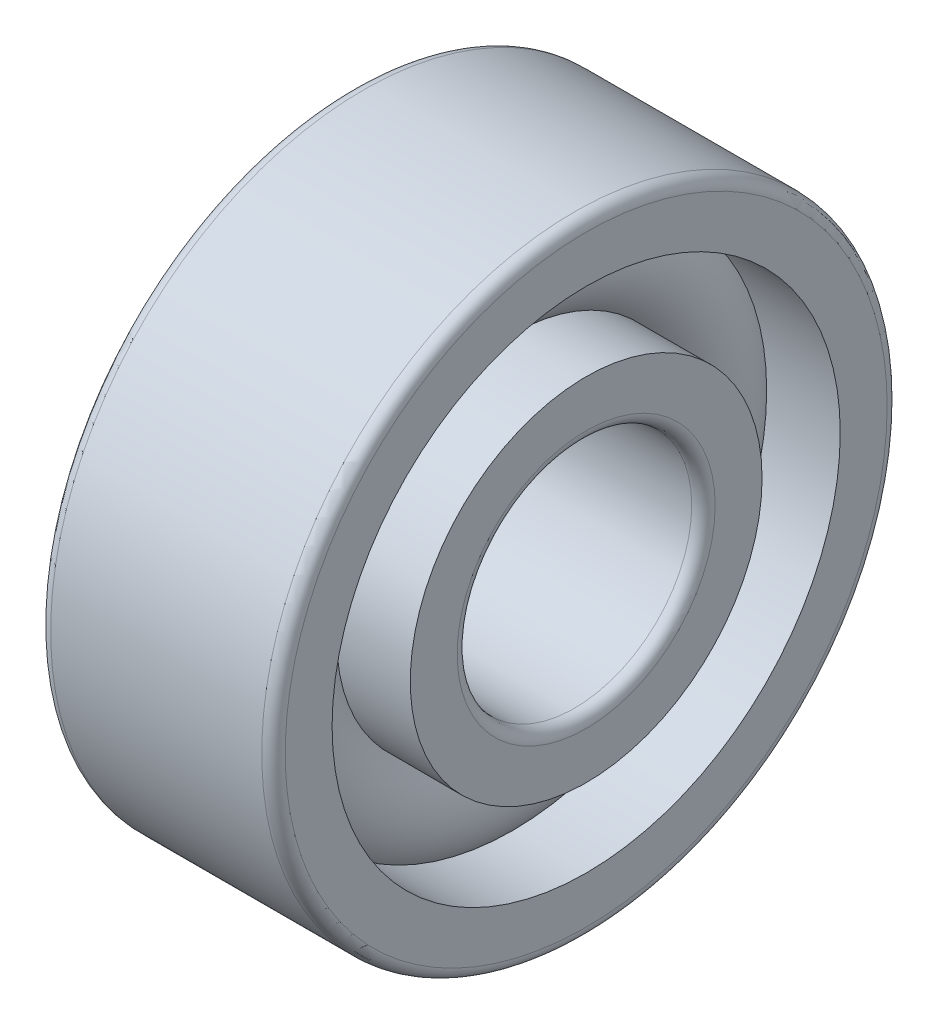
ISO-10303-21;
HEADER;
FILE_DESCRIPTION(('STEP AP214'),'2;1');
FILE_NAME('part.step','',(''),(''),'','','');
FILE_SCHEMA(('AUTOMOTIVE_DESIGN { 1 0 10303 214 1 1 1 1 }'));
ENDSEC;
DATA;
#1=APPLICATION_CONTEXT('core data for automotive mechanical design processes');
#2=APPLICATION_PROTOCOL_DEFINITION('international standard','automotive_design',2000,#1);
#3=PRODUCT_CONTEXT('',#1,'mechanical');
#4=PRODUCT('Part','Part','',(#3));
#5=PRODUCT_RELATED_PRODUCT_CATEGORY('part','',(#4));
#6=PRODUCT_DEFINITION_FORMATION('','',#4);
#7=PRODUCT_DEFINITION_CONTEXT('part definition',#1,'design');
#8=PRODUCT_DEFINITION('design','',#6,#7);
#9=PRODUCT_DEFINITION_SHAPE('','',#8);
#10=(LENGTH_UNIT() NAMED_UNIT(*) SI_UNIT(.MILLI.,.METRE.));
#11=(NAMED_UNIT(*) PLANE_ANGLE_UNIT() SI_UNIT($,.RADIAN.));
#12=(NAMED_UNIT(*) SI_UNIT($,.STERADIAN.) SOLID_ANGLE_UNIT());
#13=UNCERTAINTY_MEASURE_WITH_UNIT(LENGTH_MEASURE(1.E-05),#10,'distance_accuracy_value','');
#14=(GEOMETRIC_REPRESENTATION_CONTEXT(3) GLOBAL_UNCERTAINTY_ASSIGNED_CONTEXT((#13)) GLOBAL_UNIT_ASSIGNED_CONTEXT((#10,
#11,#12)) REPRESENTATION_CONTEXT('',''));
#15=CARTESIAN_POINT('',(0.,0.,0.));
#16=DIRECTION('',(0.,0.,1.));
#17=DIRECTION('',(1.,0.,0.));
#18=AXIS2_PLACEMENT_3D('',#15,#16,#17);
#19=CARTESIAN_POINT('',(0.,0.,0.));
#20=DIRECTION('',(-1.,0.,0.));
#21=DIRECTION('',(0.,0.,1.));
#22=AXIS2_PLACEMENT_3D('',#19,#20,#21);
#23=TOROIDAL_SURFACE('',#22,2.75,0.75);
#24=CARTESIAN_POINT('',(0.559016994374943,0.,0.));
#25=DIRECTION('',(-1.,0.,0.));
#26=DIRECTION('',(0.,0.,1.));
#27=AXIS2_PLACEMENT_3D('',#24,#25,#26);
#28=CIRCLE('',#27,3.25);
#29=CARTESIAN_POINT('',(0.559016994374943,0.,3.25));
#30=VERTEX_POINT('',#29);
#31=EDGE_CURVE('E36',#30,#30,#28,.F.);
#32=ORIENTED_EDGE('',*,*,#31,.T.);
#33=EDGE_LOOP('',(#32));
#34=FACE_BOUND('',#33,.T.);
#35=CARTESIAN_POINT('',(0.559016994374947,0.,0.));
#36=DIRECTION('',(-1.,0.,0.));
#37=DIRECTION('',(0.,0.,1.));
#38=AXIS2_PLACEMENT_3D('',#35,#36,#37);
#39=CIRCLE('',#38,2.25);
#40=CARTESIAN_POINT('',(0.559016994374947,0.,2.25));
#41=VERTEX_POINT('',#40);
#42=EDGE_CURVE('E10',#41,#41,#39,.T.);
#43=ORIENTED_EDGE('',*,*,#42,.T.);
#44=EDGE_LOOP('',(#43));
#45=FACE_BOUND('',#44,.T.);
#46=ADVANCED_FACE('F32',(#34,#45),#23,.T.);
#47=CARTESIAN_POINT('',(-20.6375,0.,0.));
#48=DIRECTION('',(1.,0.,0.));
#49=DIRECTION('',(0.,0.,-1.));
#50=AXIS2_PLACEMENT_3D('',#47,#48,#49);
#51=CYLINDRICAL_SURFACE('',#50,2.25);
#52=CARTESIAN_POINT('',(1.5,0.,0.));
#53=DIRECTION('',(1.,0.,0.));
#54=DIRECTION('',(0.,0.,-1.));
#55=AXIS2_PLACEMENT_3D('',#52,#53,#54);
#56=CIRCLE('',#55,2.25);
#57=CARTESIAN_POINT('',(1.5,0.,-2.25));
#58=VERTEX_POINT('',#57);
#59=EDGE_CURVE('E45',#58,#58,#56,.T.);
#60=ORIENTED_EDGE('',*,*,#59,.F.);
#61=EDGE_LOOP('',(#60));
#62=FACE_BOUND('',#61,.T.);
#63=ORIENTED_EDGE('',*,*,#42,.F.);
#64=EDGE_LOOP('',(#63));
#65=FACE_BOUND('',#64,.T.);
#66=ADVANCED_FACE('F84',(#62,#65),#51,.T.);
#67=CARTESIAN_POINT('',(-20.6375,0.,0.));
#68=DIRECTION('',(1.,0.,0.));
#69=DIRECTION('',(0.,0.,-1.));
#70=AXIS2_PLACEMENT_3D('',#67,#68,#69);
#71=CYLINDRICAL_SURFACE('',#70,2.25);
#72=CARTESIAN_POINT('',(-1.5,0.,0.));
#73=DIRECTION('',(1.,0.,0.));
#74=DIRECTION('',(0.,0.,-1.));
#75=AXIS2_PLACEMENT_3D('',#72,#73,#74);
#76=CIRCLE('',#75,2.25);
#77=CARTESIAN_POINT('',(-1.5,0.,-2.25));
#78=VERTEX_POINT('',#77);
#79=EDGE_CURVE('E54',#78,#78,#76,.T.);
#80=ORIENTED_EDGE('',*,*,#79,.T.);
#81=EDGE_LOOP('',(#80));
#82=FACE_BOUND('',#81,.T.);
#83=CARTESIAN_POINT('',(-0.559016994374947,0.,0.));
#84=DIRECTION('',(1.,0.,0.));
#85=DIRECTION('',(0.,0.,-1.));
#86=AXIS2_PLACEMENT_3D('',#83,#84,#85);
#87=CIRCLE('',#86,2.25);
#88=CARTESIAN_POINT('',(-0.559016994374947,0.,-2.25));
#89=VERTEX_POINT('',#88);
#90=EDGE_CURVE('E40',#89,#89,#87,.T.);
#91=ORIENTED_EDGE('',*,*,#90,.F.);
#92=EDGE_LOOP('',(#91));
#93=FACE_BOUND('',#92,.T.);
#94=ADVANCED_FACE('F87',(#82,#93),#71,.T.);
#95=CARTESIAN_POINT('',(1.5,1.65,0.));
#96=DIRECTION('',(1.,0.,0.));
#97=DIRECTION('',(0.,0.,-1.));
#98=AXIS2_PLACEMENT_3D('',#95,#96,#97);
#99=PLANE('',#98);
#100=ORIENTED_EDGE('',*,*,#59,.T.);
#101=EDGE_LOOP('',(#100));
#102=FACE_BOUND('',#101,.T.);
#103=CARTESIAN_POINT('',(1.5,0.,0.));
#104=DIRECTION('',(1.,0.,0.));
#105=DIRECTION('',(0.,0.,-1.));
#106=AXIS2_PLACEMENT_3D('',#103,#104,#105);
#107=CIRCLE('',#106,1.65);
#108=CARTESIAN_POINT('',(1.5,0.,-1.65));
#109=VERTEX_POINT('',#108);
#110=EDGE_CURVE('E76',#109,#109,#107,.T.);
#111=ORIENTED_EDGE('',*,*,#110,.F.);
#112=EDGE_LOOP('',(#111));
#113=FACE_BOUND('',#112,.T.);
#114=ADVANCED_FACE('F81',(#102,#113),#99,.T.);
#115=CARTESIAN_POINT('',(1.35,0.,0.));
#116=DIRECTION('',(1.,0.,0.));
#117=DIRECTION('',(0.,0.,-1.));
#118=AXIS2_PLACEMENT_3D('',#115,#116,#117);
#119=TOROIDAL_SURFACE('',#118,1.65,0.15);
#120=ORIENTED_EDGE('',*,*,#110,.T.);
#121=EDGE_LOOP('',(#120));
#122=FACE_BOUND('',#121,.T.);
#123=CARTESIAN_POINT('',(1.35,0.,0.));
#124=DIRECTION('',(1.,0.,0.));
#125=DIRECTION('',(0.,0.,-1.));
#126=AXIS2_PLACEMENT_3D('',#123,#124,#125);
#127=CIRCLE('',#126,1.5);
#128=CARTESIAN_POINT('',(1.35,0.,-1.5));
#129=VERTEX_POINT('',#128);
#130=EDGE_CURVE('E73',#129,#129,#127,.T.);
#131=ORIENTED_EDGE('',*,*,#130,.F.);
#132=EDGE_LOOP('',(#131));
#133=FACE_BOUND('',#132,.T.);
#134=ADVANCED_FACE('F98',(#122,#133),#119,.T.);
#135=CARTESIAN_POINT('',(-20.6375,0.,0.));
#136=DIRECTION('',(1.,0.,0.));
#137=DIRECTION('',(0.,0.,-1.));
#138=AXIS2_PLACEMENT_3D('',#135,#136,#137);
#139=CYLINDRICAL_SURFACE('',#138,1.5);
#140=ORIENTED_EDGE('',*,*,#130,.T.);
#141=EDGE_LOOP('',(#140));
#142=FACE_BOUND('',#141,.T.);
#143=CARTESIAN_POINT('',(-1.35,0.,0.));
#144=DIRECTION('',(1.,0.,0.));
#145=DIRECTION('',(0.,0.,-1.));
#146=AXIS2_PLACEMENT_3D('',#143,#144,#145);
#147=CIRCLE('',#146,1.5);
#148=CARTESIAN_POINT('',(-1.35,0.,-1.5));
#149=VERTEX_POINT('',#148);
#150=EDGE_CURVE('E70',#149,#149,#147,.T.);
#151=ORIENTED_EDGE('',*,*,#150,.F.);
#152=EDGE_LOOP('',(#151));
#153=FACE_BOUND('',#152,.T.);
#154=ADVANCED_FACE('F101',(#142,#153),#139,.F.);
#155=CARTESIAN_POINT('',(-1.35,0.,0.));
#156=DIRECTION('',(1.,0.,0.));
#157=DIRECTION('',(0.,0.,-1.));
#158=AXIS2_PLACEMENT_3D('',#155,#156,#157);
#159=TOROIDAL_SURFACE('',#158,1.65,0.15);
#160=ORIENTED_EDGE('',*,*,#150,.T.);
#161=EDGE_LOOP('',(#160));
#162=FACE_BOUND('',#161,.T.);
#163=CARTESIAN_POINT('',(-1.5,0.,0.));
#164=DIRECTION('',(1.,0.,0.));
#165=DIRECTION('',(0.,0.,-1.));
#166=AXIS2_PLACEMENT_3D('',#163,#164,#165);
#167=CIRCLE('',#166,1.65);
#168=CARTESIAN_POINT('',(-1.5,0.,-1.65));
#169=VERTEX_POINT('',#168);
#170=EDGE_CURVE('E67',#169,#169,#167,.T.);
#171=ORIENTED_EDGE('',*,*,#170,.F.);
#172=EDGE_LOOP('',(#171));
#173=FACE_BOUND('',#172,.T.);
#174=ADVANCED_FACE('F105',(#162,#173),#159,.T.);
#175=CARTESIAN_POINT('',(-1.5,2.25,0.));
#176=DIRECTION('',(-1.,0.,0.));
#177=DIRECTION('',(0.,0.,1.));
#178=AXIS2_PLACEMENT_3D('',#175,#176,#177);
#179=PLANE('',#178);
#180=ORIENTED_EDGE('',*,*,#170,.T.);
#181=EDGE_LOOP('',(#180));
#182=FACE_BOUND('',#181,.T.);
#183=ORIENTED_EDGE('',*,*,#79,.F.);
#184=EDGE_LOOP('',(#183));
#185=FACE_BOUND('',#184,.T.);
#186=ADVANCED_FACE('F109',(#182,#185),#179,.T.);
#187=CARTESIAN_POINT('',(-0.559016994374943,0.,0.));
#188=DIRECTION('',(1.,0.,0.));
#189=DIRECTION('',(0.,0.,-1.));
#190=AXIS2_PLACEMENT_3D('',#187,#188,#189);
#191=CIRCLE('',#190,3.25);
#192=CARTESIAN_POINT('',(-0.559016994374943,0.,-3.25));
#193=VERTEX_POINT('',#192);
#194=EDGE_CURVE('E48',#193,#193,#191,.F.);
#195=ORIENTED_EDGE('',*,*,#194,.T.);
#196=EDGE_LOOP('',(#195));
#197=FACE_BOUND('',#196,.T.);
#198=ORIENTED_EDGE('',*,*,#90,.T.);
#199=EDGE_LOOP('',(#198));
#200=FACE_BOUND('',#199,.T.);
#201=ADVANCED_FACE('F34',(#197,#200),#23,.T.);
#202=CARTESIAN_POINT('',(-20.6375,0.,0.));
#203=DIRECTION('',(1.,0.,0.));
#204=DIRECTION('',(0.,0.,-1.));
#205=AXIS2_PLACEMENT_3D('',#202,#203,#204);
#206=CYLINDRICAL_SURFACE('',#205,3.25);
#207=CARTESIAN_POINT('',(1.5,0.,0.));
#208=DIRECTION('',(1.,0.,0.));
#209=DIRECTION('',(0.,0.,-1.));
#210=AXIS2_PLACEMENT_3D('',#207,#208,#209);
#211=CIRCLE('',#210,3.25);
#212=CARTESIAN_POINT('',(1.5,0.,-3.25));
#213=VERTEX_POINT('',#212);
#214=EDGE_CURVE('E50',#213,#213,#211,.T.);
#215=ORIENTED_EDGE('',*,*,#214,.T.);
#216=EDGE_LOOP('',(#215));
#217=FACE_BOUND('',#216,.T.);
#218=ORIENTED_EDGE('',*,*,#31,.F.);
#219=EDGE_LOOP('',(#218));
#220=FACE_BOUND('',#219,.T.);
#221=ADVANCED_FACE('F114',(#217,#220),#206,.F.);
#222=CARTESIAN_POINT('',(-20.6375,0.,0.));
#223=DIRECTION('',(1.,0.,0.));
#224=DIRECTION('',(0.,0.,-1.));
#225=AXIS2_PLACEMENT_3D('',#222,#223,#224);
#226=CYLINDRICAL_SURFACE('',#225,3.25);
#227=CARTESIAN_POINT('',(-1.5,0.,0.));
#228=DIRECTION('',(1.,0.,0.));
#229=DIRECTION('',(0.,0.,-1.));
#230=AXIS2_PLACEMENT_3D('',#227,#228,#229);
#231=CIRCLE('',#230,3.25);
#232=CARTESIAN_POINT('',(-1.5,0.,-3.25));
#233=VERTEX_POINT('',#232);
#234=EDGE_CURVE('E145',#233,#233,#231,.T.);
#235=ORIENTED_EDGE('',*,*,#234,.F.);
#236=EDGE_LOOP('',(#235));
#237=FACE_BOUND('',#236,.T.);
#238=ORIENTED_EDGE('',*,*,#194,.F.);
#239=EDGE_LOOP('',(#238));
#240=FACE_BOUND('',#239,.T.);
#241=ADVANCED_FACE('F117',(#237,#240),#226,.F.);
#242=CARTESIAN_POINT('',(1.5,3.85000000000001,0.));
#243=DIRECTION('',(1.,0.,0.));
#244=DIRECTION('',(0.,0.,-1.));
#245=AXIS2_PLACEMENT_3D('',#242,#243,#244);
#246=PLANE('',#245);
#247=CARTESIAN_POINT('',(1.5,0.,0.));
#248=DIRECTION('',(1.,0.,0.));
#249=DIRECTION('',(0.,0.,-1.));
#250=AXIS2_PLACEMENT_3D('',#247,#248,#249);
#251=CIRCLE('',#250,3.85000000000001);
#252=CARTESIAN_POINT('',(1.5,0.,-3.85000000000001));
#253=VERTEX_POINT('',#252);
#254=EDGE_CURVE('E56',#253,#253,#251,.T.);
#255=ORIENTED_EDGE('',*,*,#254,.T.);
#256=EDGE_LOOP('',(#255));
#257=FACE_BOUND('',#256,.T.);
#258=ORIENTED_EDGE('',*,*,#214,.F.);
#259=EDGE_LOOP('',(#258));
#260=FACE_BOUND('',#259,.T.);
#261=ADVANCED_FACE('F118',(#257,#260),#246,.T.);
#262=CARTESIAN_POINT('',(1.35,0.,0.));
#263=DIRECTION('',(1.,0.,0.));
#264=DIRECTION('',(0.,0.,-1.));
#265=AXIS2_PLACEMENT_3D('',#262,#263,#264);
#266=TOROIDAL_SURFACE('',#265,3.85000000000001,0.15);
#267=CARTESIAN_POINT('',(1.35,0.,0.));
#268=DIRECTION('',(1.,0.,0.));
#269=DIRECTION('',(0.,0.,-1.));
#270=AXIS2_PLACEMENT_3D('',#267,#268,#269);
#271=CIRCLE('',#270,4.);
#272=CARTESIAN_POINT('',(1.35,0.,-4.));
#273=VERTEX_POINT('',#272);
#274=EDGE_CURVE('E61',#273,#273,#271,.T.);
#275=ORIENTED_EDGE('',*,*,#274,.T.);
#276=EDGE_LOOP('',(#275));
#277=FACE_BOUND('',#276,.T.);
#278=ORIENTED_EDGE('',*,*,#254,.F.);
#279=EDGE_LOOP('',(#278));
#280=FACE_BOUND('',#279,.T.);
#281=ADVANCED_FACE('F121',(#277,#280),#266,.T.);
#282=CARTESIAN_POINT('',(-20.6375,0.,0.));
#283=DIRECTION('',(1.,0.,0.));
#284=DIRECTION('',(0.,0.,-1.));
#285=AXIS2_PLACEMENT_3D('',#282,#283,#284);
#286=CYLINDRICAL_SURFACE('',#285,4.00000000000001);
#287=CARTESIAN_POINT('',(-1.35,0.,0.));
#288=DIRECTION('',(1.,0.,0.));
#289=DIRECTION('',(0.,0.,-1.));
#290=AXIS2_PLACEMENT_3D('',#287,#288,#289);
#291=CIRCLE('',#290,4.00000000000001);
#292=CARTESIAN_POINT('',(-1.35,0.,-4.00000000000001));
#293=VERTEX_POINT('',#292);
#294=EDGE_CURVE('E149',#293,#293,#291,.T.);
#295=ORIENTED_EDGE('',*,*,#294,.T.);
#296=EDGE_LOOP('',(#295));
#297=FACE_BOUND('',#296,.T.);
#298=ORIENTED_EDGE('',*,*,#274,.F.);
#299=EDGE_LOOP('',(#298));
#300=FACE_BOUND('',#299,.T.);
#301=ADVANCED_FACE('F125',(#297,#300),#286,.T.);
#302=CARTESIAN_POINT('',(-1.35,0.,0.));
#303=DIRECTION('',(1.,0.,0.));
#304=DIRECTION('',(0.,0.,-1.));
#305=AXIS2_PLACEMENT_3D('',#302,#303,#304);
#306=TOROIDAL_SURFACE('',#305,3.85000000000001,0.15);
#307=CARTESIAN_POINT('',(-1.5,0.,0.));
#308=DIRECTION('',(1.,0.,0.));
#309=DIRECTION('',(0.,0.,-1.));
#310=AXIS2_PLACEMENT_3D('',#307,#308,#309);
#311=CIRCLE('',#310,3.85000000000001);
#312=CARTESIAN_POINT('',(-1.5,0.,-3.85000000000001));
#313=VERTEX_POINT('',#312);
#314=EDGE_CURVE('E146',#313,#313,#311,.T.);
#315=ORIENTED_EDGE('',*,*,#314,.T.);
#316=EDGE_LOOP('',(#315));
#317=FACE_BOUND('',#316,.T.);
#318=ORIENTED_EDGE('',*,*,#294,.F.);
#319=EDGE_LOOP('',(#318));
#320=FACE_BOUND('',#319,.T.);
#321=ADVANCED_FACE('F129',(#317,#320),#306,.T.);
#322=CARTESIAN_POINT('',(-1.5,3.25,0.));
#323=DIRECTION('',(-1.,0.,0.));
#324=DIRECTION('',(0.,0.,1.));
#325=AXIS2_PLACEMENT_3D('',#322,#323,#324);
#326=PLANE('',#325);
#327=ORIENTED_EDGE('',*,*,#234,.T.);
#328=EDGE_LOOP('',(#327));
#329=FACE_BOUND('',#328,.T.);
#330=ORIENTED_EDGE('',*,*,#314,.F.);
#331=EDGE_LOOP('',(#330));
#332=FACE_BOUND('',#331,.T.);
#333=ADVANCED_FACE('F133',(#329,#332),#326,.T.);
#334=CLOSED_SHELL('',(#46,#66,#94,#114,#134,#154,#174,#186,#201,#221,#241,#261,#281,#301,#321,#333));
#335=MANIFOLD_SOLID_BREP('B2',#334);
#336=ADVANCED_BREP_SHAPE_REPRESENTATION('',(#18,#335),#14);
#337=SHAPE_DEFINITION_REPRESENTATION(#9,#336);
ENDSEC;
END-ISO-10303-21;
